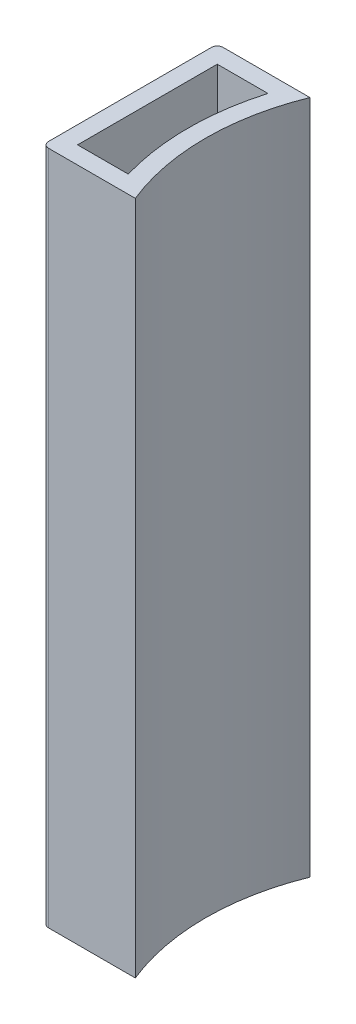
ISO-10303-21;
HEADER;
FILE_DESCRIPTION(('STEP AP214'),'2;1');
FILE_NAME('part.step','',(''),(''),'','','');
FILE_SCHEMA(('AUTOMOTIVE_DESIGN { 1 0 10303 214 1 1 1 1 }'));
ENDSEC;
DATA;
#1=APPLICATION_CONTEXT('core data for automotive mechanical design processes');
#2=APPLICATION_PROTOCOL_DEFINITION('international standard','automotive_design',2000,#1);
#3=PRODUCT_CONTEXT('',#1,'mechanical');
#4=PRODUCT('Part','Part','',(#3));
#5=PRODUCT_RELATED_PRODUCT_CATEGORY('part','',(#4));
#6=PRODUCT_DEFINITION_FORMATION('','',#4);
#7=PRODUCT_DEFINITION_CONTEXT('part definition',#1,'design');
#8=PRODUCT_DEFINITION('design','',#6,#7);
#9=PRODUCT_DEFINITION_SHAPE('','',#8);
#10=(LENGTH_UNIT() NAMED_UNIT(*) SI_UNIT(.MILLI.,.METRE.));
#11=(NAMED_UNIT(*) PLANE_ANGLE_UNIT() SI_UNIT($,.RADIAN.));
#12=(NAMED_UNIT(*) SI_UNIT($,.STERADIAN.) SOLID_ANGLE_UNIT());
#13=UNCERTAINTY_MEASURE_WITH_UNIT(LENGTH_MEASURE(1.E-05),#10,'distance_accuracy_value','');
#14=(GEOMETRIC_REPRESENTATION_CONTEXT(3) GLOBAL_UNCERTAINTY_ASSIGNED_CONTEXT((#13)) GLOBAL_UNIT_ASSIGNED_CONTEXT((#10,
#11,#12)) REPRESENTATION_CONTEXT('',''));
#15=CARTESIAN_POINT('',(0.,0.,0.));
#16=DIRECTION('',(0.,0.,1.));
#17=DIRECTION('',(1.,0.,0.));
#18=AXIS2_PLACEMENT_3D('',#15,#16,#17);
#19=CARTESIAN_POINT('',(0.,116.,0.));
#20=DIRECTION('',(0.,1.,0.));
#21=DIRECTION('',(0.,0.,1.));
#22=AXIS2_PLACEMENT_3D('',#19,#20,#21);
#23=PLANE('',#22);
#24=DIRECTION('',(0.,0.,1.));
#25=VECTOR('',#24,1.);
#26=CARTESIAN_POINT('',(0.,116.,0.));
#27=LINE('',#26,#25);
#28=CARTESIAN_POINT('',(0.,116.,1.));
#29=VERTEX_POINT('',#28);
#30=CARTESIAN_POINT('',(0.,116.,29.));
#31=VERTEX_POINT('',#30);
#32=EDGE_CURVE('E212',#29,#31,#27,.T.);
#33=ORIENTED_EDGE('',*,*,#32,.T.);
#34=CARTESIAN_POINT('',(1.,116.,29.));
#35=DIRECTION('',(0.,1.,0.));
#36=DIRECTION('',(0.,0.,1.));
#37=AXIS2_PLACEMENT_3D('',#34,#35,#36);
#38=CIRCLE('',#37,1.);
#39=CARTESIAN_POINT('',(1.,116.,30.));
#40=VERTEX_POINT('',#39);
#41=EDGE_CURVE('E45',#31,#40,#38,.T.);
#42=ORIENTED_EDGE('',*,*,#41,.T.);
#43=DIRECTION('',(1.,0.,0.));
#44=VECTOR('',#43,1.);
#45=CARTESIAN_POINT('',(0.,116.,30.));
#46=LINE('',#45,#44);
#47=CARTESIAN_POINT('',(15.9190075645217,116.,30.));
#48=VERTEX_POINT('',#47);
#49=EDGE_CURVE('E215',#40,#48,#46,.T.);
#50=ORIENTED_EDGE('',*,*,#49,.T.);
#51=CARTESIAN_POINT('',(53.,116.,15.));
#52=DIRECTION('',(0.,1.,0.));
#53=DIRECTION('',(0.,0.,1.));
#54=AXIS2_PLACEMENT_3D('',#51,#52,#53);
#55=CIRCLE('',#54,40.);
#56=CARTESIAN_POINT('',(15.9190075645217,116.,0.));
#57=VERTEX_POINT('',#56);
#58=EDGE_CURVE('E206',#57,#48,#55,.T.);
#59=ORIENTED_EDGE('',*,*,#58,.F.);
#60=DIRECTION('',(1.,0.,0.));
#61=VECTOR('',#60,1.);
#62=CARTESIAN_POINT('',(0.,116.,0.));
#63=LINE('',#62,#61);
#64=CARTESIAN_POINT('',(1.,116.,0.));
#65=VERTEX_POINT('',#64);
#66=EDGE_CURVE('E209',#65,#57,#63,.T.);
#67=ORIENTED_EDGE('',*,*,#66,.F.);
#68=CARTESIAN_POINT('',(1.,116.,1.));
#69=DIRECTION('',(0.,1.,0.));
#70=DIRECTION('',(0.,0.,1.));
#71=AXIS2_PLACEMENT_3D('',#68,#69,#70);
#72=CIRCLE('',#71,1.);
#73=EDGE_CURVE('E243',#65,#29,#72,.T.);
#74=ORIENTED_EDGE('',*,*,#73,.T.);
#75=EDGE_LOOP('',(#33,#42,#50,#59,#67,#74));
#76=FACE_BOUND('',#75,.T.);
#77=DIRECTION('',(1.,0.,0.));
#78=VECTOR('',#77,1.);
#79=CARTESIAN_POINT('',(0.,116.,3.));
#80=LINE('',#79,#78);
#81=CARTESIAN_POINT('',(3.,116.,3.));
#82=VERTEX_POINT('',#81);
#83=CARTESIAN_POINT('',(11.7083543558748,116.,3.));
#84=VERTEX_POINT('',#83);
#85=EDGE_CURVE('E199',#82,#84,#80,.T.);
#86=ORIENTED_EDGE('',*,*,#85,.T.);
#87=CARTESIAN_POINT('',(53.,116.,15.));
#88=DIRECTION('',(0.,1.,0.));
#89=DIRECTION('',(0.,0.,1.));
#90=AXIS2_PLACEMENT_3D('',#87,#88,#89);
#91=CIRCLE('',#90,43.);
#92=CARTESIAN_POINT('',(11.7083543558748,116.,27.));
#93=VERTEX_POINT('',#92);
#94=EDGE_CURVE('E191',#84,#93,#91,.T.);
#95=ORIENTED_EDGE('',*,*,#94,.T.);
#96=DIRECTION('',(1.,0.,0.));
#97=VECTOR('',#96,1.);
#98=CARTESIAN_POINT('',(0.,116.,27.));
#99=LINE('',#98,#97);
#100=CARTESIAN_POINT('',(3.,116.,27.));
#101=VERTEX_POINT('',#100);
#102=EDGE_CURVE('E181',#101,#93,#99,.T.);
#103=ORIENTED_EDGE('',*,*,#102,.F.);
#104=DIRECTION('',(0.,0.,1.));
#105=VECTOR('',#104,1.);
#106=CARTESIAN_POINT('',(3.,116.,0.));
#107=LINE('',#106,#105);
#108=EDGE_CURVE('E202',#82,#101,#107,.T.);
#109=ORIENTED_EDGE('',*,*,#108,.F.);
#110=EDGE_LOOP('',(#86,#95,#103,#109));
#111=FACE_BOUND('',#110,.T.);
#112=ADVANCED_FACE('F37',(#76,#111),#23,.T.);
#113=CARTESIAN_POINT('',(0.,0.,0.));
#114=DIRECTION('',(0.,1.,0.));
#115=DIRECTION('',(0.,0.,1.));
#116=AXIS2_PLACEMENT_3D('',#113,#114,#115);
#117=PLANE('',#116);
#118=DIRECTION('',(1.,0.,0.));
#119=VECTOR('',#118,1.);
#120=CARTESIAN_POINT('',(0.,0.,30.));
#121=LINE('',#120,#119);
#122=CARTESIAN_POINT('',(1.,0.,30.));
#123=VERTEX_POINT('',#122);
#124=CARTESIAN_POINT('',(15.9190075645217,0.,30.));
#125=VERTEX_POINT('',#124);
#126=EDGE_CURVE('E210',#123,#125,#121,.T.);
#127=ORIENTED_EDGE('',*,*,#126,.F.);
#128=CARTESIAN_POINT('',(1.,0.,29.));
#129=DIRECTION('',(0.,1.,0.));
#130=DIRECTION('',(0.,0.,1.));
#131=AXIS2_PLACEMENT_3D('',#128,#129,#130);
#132=CIRCLE('',#131,1.);
#133=CARTESIAN_POINT('',(0.,0.,29.));
#134=VERTEX_POINT('',#133);
#135=EDGE_CURVE('E236',#123,#134,#132,.F.);
#136=ORIENTED_EDGE('',*,*,#135,.T.);
#137=DIRECTION('',(0.,0.,1.));
#138=VECTOR('',#137,1.);
#139=CARTESIAN_POINT('',(0.,0.,0.));
#140=LINE('',#139,#138);
#141=CARTESIAN_POINT('',(0.,0.,1.));
#142=VERTEX_POINT('',#141);
#143=EDGE_CURVE('E222',#142,#134,#140,.T.);
#144=ORIENTED_EDGE('',*,*,#143,.F.);
#145=CARTESIAN_POINT('',(1.,0.,1.));
#146=DIRECTION('',(0.,1.,0.));
#147=DIRECTION('',(0.,0.,1.));
#148=AXIS2_PLACEMENT_3D('',#145,#146,#147);
#149=CIRCLE('',#148,1.);
#150=CARTESIAN_POINT('',(1.,0.,0.));
#151=VERTEX_POINT('',#150);
#152=EDGE_CURVE('E234',#142,#151,#149,.F.);
#153=ORIENTED_EDGE('',*,*,#152,.T.);
#154=DIRECTION('',(1.,0.,0.));
#155=VECTOR('',#154,1.);
#156=CARTESIAN_POINT('',(0.,0.,0.));
#157=LINE('',#156,#155);
#158=CARTESIAN_POINT('',(15.9190075645217,0.,0.));
#159=VERTEX_POINT('',#158);
#160=EDGE_CURVE('E220',#151,#159,#157,.T.);
#161=ORIENTED_EDGE('',*,*,#160,.T.);
#162=CARTESIAN_POINT('',(53.,0.,15.));
#163=DIRECTION('',(0.,1.,0.));
#164=DIRECTION('',(0.,0.,1.));
#165=AXIS2_PLACEMENT_3D('',#162,#163,#164);
#166=CIRCLE('',#165,40.);
#167=EDGE_CURVE('E176',#159,#125,#166,.T.);
#168=ORIENTED_EDGE('',*,*,#167,.T.);
#169=EDGE_LOOP('',(#127,#136,#144,#153,#161,#168));
#170=FACE_BOUND('',#169,.T.);
#171=CARTESIAN_POINT('',(53.,0.,15.));
#172=DIRECTION('',(0.,1.,0.));
#173=DIRECTION('',(0.,0.,1.));
#174=AXIS2_PLACEMENT_3D('',#171,#172,#173);
#175=CIRCLE('',#174,43.);
#176=CARTESIAN_POINT('',(11.7083543558748,0.,3.));
#177=VERTEX_POINT('',#176);
#178=CARTESIAN_POINT('',(11.7083543558748,0.,27.));
#179=VERTEX_POINT('',#178);
#180=EDGE_CURVE('E170',#177,#179,#175,.T.);
#181=ORIENTED_EDGE('',*,*,#180,.F.);
#182=DIRECTION('',(1.,0.,0.));
#183=VECTOR('',#182,1.);
#184=CARTESIAN_POINT('',(0.,0.,3.));
#185=LINE('',#184,#183);
#186=CARTESIAN_POINT('',(3.,0.,3.));
#187=VERTEX_POINT('',#186);
#188=EDGE_CURVE('E187',#187,#177,#185,.T.);
#189=ORIENTED_EDGE('',*,*,#188,.F.);
#190=DIRECTION('',(0.,0.,1.));
#191=VECTOR('',#190,1.);
#192=CARTESIAN_POINT('',(3.,0.,0.));
#193=LINE('',#192,#191);
#194=CARTESIAN_POINT('',(3.,0.,27.));
#195=VERTEX_POINT('',#194);
#196=EDGE_CURVE('E192',#187,#195,#193,.T.);
#197=ORIENTED_EDGE('',*,*,#196,.T.);
#198=DIRECTION('',(1.,0.,0.));
#199=VECTOR('',#198,1.);
#200=CARTESIAN_POINT('',(0.,0.,27.));
#201=LINE('',#200,#199);
#202=EDGE_CURVE('E188',#195,#179,#201,.T.);
#203=ORIENTED_EDGE('',*,*,#202,.T.);
#204=EDGE_LOOP('',(#181,#189,#197,#203));
#205=FACE_BOUND('',#204,.T.);
#206=ADVANCED_FACE('F260',(#170,#205),#117,.F.);
#207=CARTESIAN_POINT('',(53.,116.,15.));
#208=DIRECTION('',(0.,-1.,0.));
#209=DIRECTION('',(0.,0.,-1.));
#210=AXIS2_PLACEMENT_3D('',#207,#208,#209);
#211=CYLINDRICAL_SURFACE('',#210,40.);
#212=ORIENTED_EDGE('',*,*,#167,.F.);
#213=DIRECTION('',(0.,-1.,0.));
#214=VECTOR('',#213,1.);
#215=CARTESIAN_POINT('',(15.9190075645217,116.,0.));
#216=LINE('',#215,#214);
#217=EDGE_CURVE('E228',#57,#159,#216,.T.);
#218=ORIENTED_EDGE('',*,*,#217,.F.);
#219=ORIENTED_EDGE('',*,*,#58,.T.);
#220=DIRECTION('',(0.,-1.,0.));
#221=VECTOR('',#220,1.);
#222=CARTESIAN_POINT('',(15.9190075645217,116.,30.));
#223=LINE('',#222,#221);
#224=EDGE_CURVE('E217',#48,#125,#223,.T.);
#225=ORIENTED_EDGE('',*,*,#224,.T.);
#226=EDGE_LOOP('',(#212,#218,#219,#225));
#227=FACE_BOUND('',#226,.T.);
#228=ADVANCED_FACE('F275',(#227),#211,.F.);
#229=CARTESIAN_POINT('',(0.,116.,0.));
#230=DIRECTION('',(0.,0.,-1.));
#231=DIRECTION('',(-1.,0.,0.));
#232=AXIS2_PLACEMENT_3D('',#229,#230,#231);
#233=PLANE('',#232);
#234=ORIENTED_EDGE('',*,*,#160,.F.);
#235=DIRECTION('',(0.,-1.,0.));
#236=VECTOR('',#235,1.);
#237=CARTESIAN_POINT('',(1.,116.,0.));
#238=LINE('',#237,#236);
#239=EDGE_CURVE('E11',#151,#65,#238,.F.);
#240=ORIENTED_EDGE('',*,*,#239,.T.);
#241=ORIENTED_EDGE('',*,*,#66,.T.);
#242=ORIENTED_EDGE('',*,*,#217,.T.);
#243=EDGE_LOOP('',(#234,#240,#241,#242));
#244=FACE_BOUND('',#243,.T.);
#245=ADVANCED_FACE('F270',(#244),#233,.T.);
#246=CARTESIAN_POINT('',(0.,116.,0.));
#247=DIRECTION('',(1.,0.,0.));
#248=DIRECTION('',(0.,0.,-1.));
#249=AXIS2_PLACEMENT_3D('',#246,#247,#248);
#250=PLANE('',#249);
#251=DIRECTION('',(0.,-1.,0.));
#252=VECTOR('',#251,1.);
#253=CARTESIAN_POINT('',(0.,96.,11.));
#254=LINE('',#253,#252);
#255=CARTESIAN_POINT('',(0.,96.,11.));
#256=VERTEX_POINT('',#255);
#257=CARTESIAN_POINT('',(0.,20.,11.));
#258=VERTEX_POINT('',#257);
#259=EDGE_CURVE('E164',#256,#258,#254,.T.);
#260=ORIENTED_EDGE('',*,*,#259,.F.);
#261=CARTESIAN_POINT('',(0.,96.,15.));
#262=DIRECTION('',(-1.,0.,0.));
#263=DIRECTION('',(0.,0.,1.));
#264=AXIS2_PLACEMENT_3D('',#261,#262,#263);
#265=CIRCLE('',#264,4.);
#266=CARTESIAN_POINT('',(0.,96.,19.));
#267=VERTEX_POINT('',#266);
#268=EDGE_CURVE('E52',#267,#256,#265,.T.);
#269=ORIENTED_EDGE('',*,*,#268,.F.);
#270=DIRECTION('',(0.,1.,0.));
#271=VECTOR('',#270,1.);
#272=CARTESIAN_POINT('',(0.,96.,19.));
#273=LINE('',#272,#271);
#274=CARTESIAN_POINT('',(0.,20.,19.));
#275=VERTEX_POINT('',#274);
#276=EDGE_CURVE('E155',#275,#267,#273,.T.);
#277=ORIENTED_EDGE('',*,*,#276,.F.);
#278=CARTESIAN_POINT('',(0.,20.,15.));
#279=DIRECTION('',(-1.,0.,0.));
#280=DIRECTION('',(0.,0.,1.));
#281=AXIS2_PLACEMENT_3D('',#278,#279,#280);
#282=CIRCLE('',#281,4.);
#283=EDGE_CURVE('E158',#258,#275,#282,.T.);
#284=ORIENTED_EDGE('',*,*,#283,.F.);
#285=EDGE_LOOP('',(#260,#269,#277,#284));
#286=FACE_BOUND('',#285,.T.);
#287=ORIENTED_EDGE('',*,*,#143,.T.);
#288=DIRECTION('',(0.,-1.,0.));
#289=VECTOR('',#288,1.);
#290=CARTESIAN_POINT('',(0.,116.,29.));
#291=LINE('',#290,#289);
#292=EDGE_CURVE('E241',#134,#31,#291,.F.);
#293=ORIENTED_EDGE('',*,*,#292,.T.);
#294=ORIENTED_EDGE('',*,*,#32,.F.);
#295=DIRECTION('',(0.,-1.,0.));
#296=VECTOR('',#295,1.);
#297=CARTESIAN_POINT('',(0.,0.,1.));
#298=LINE('',#297,#296);
#299=EDGE_CURVE('E238',#29,#142,#298,.T.);
#300=ORIENTED_EDGE('',*,*,#299,.T.);
#301=EDGE_LOOP('',(#287,#293,#294,#300));
#302=FACE_BOUND('',#301,.T.);
#303=ADVANCED_FACE('F263',(#286,#302),#250,.F.);
#304=CARTESIAN_POINT('',(0.,116.,30.));
#305=DIRECTION('',(0.,0.,-1.));
#306=DIRECTION('',(-1.,0.,0.));
#307=AXIS2_PLACEMENT_3D('',#304,#305,#306);
#308=PLANE('',#307);
#309=ORIENTED_EDGE('',*,*,#49,.F.);
#310=DIRECTION('',(0.,-1.,0.));
#311=VECTOR('',#310,1.);
#312=CARTESIAN_POINT('',(1.,116.,30.));
#313=LINE('',#312,#311);
#314=EDGE_CURVE('E231',#40,#123,#313,.T.);
#315=ORIENTED_EDGE('',*,*,#314,.T.);
#316=ORIENTED_EDGE('',*,*,#126,.T.);
#317=ORIENTED_EDGE('',*,*,#224,.F.);
#318=EDGE_LOOP('',(#309,#315,#316,#317));
#319=FACE_BOUND('',#318,.T.);
#320=ADVANCED_FACE('F255',(#319),#308,.F.);
#321=CARTESIAN_POINT('',(53.,116.,15.));
#322=DIRECTION('',(0.,-1.,0.));
#323=DIRECTION('',(0.,0.,-1.));
#324=AXIS2_PLACEMENT_3D('',#321,#322,#323);
#325=CYLINDRICAL_SURFACE('',#324,43.);
#326=ORIENTED_EDGE('',*,*,#180,.T.);
#327=DIRECTION('',(0.,-1.,0.));
#328=VECTOR('',#327,1.);
#329=CARTESIAN_POINT('',(11.7083543558748,116.,27.));
#330=LINE('',#329,#328);
#331=EDGE_CURVE('E178',#93,#179,#330,.T.);
#332=ORIENTED_EDGE('',*,*,#331,.F.);
#333=ORIENTED_EDGE('',*,*,#94,.F.);
#334=DIRECTION('',(0.,-1.,0.));
#335=VECTOR('',#334,1.);
#336=CARTESIAN_POINT('',(11.7083543558748,116.,3.));
#337=LINE('',#336,#335);
#338=EDGE_CURVE('E174',#84,#177,#337,.T.);
#339=ORIENTED_EDGE('',*,*,#338,.T.);
#340=EDGE_LOOP('',(#326,#332,#333,#339));
#341=FACE_BOUND('',#340,.T.);
#342=ADVANCED_FACE('F297',(#341),#325,.T.);
#343=CARTESIAN_POINT('',(0.,116.,3.));
#344=DIRECTION('',(0.,0.,-1.));
#345=DIRECTION('',(-1.,0.,0.));
#346=AXIS2_PLACEMENT_3D('',#343,#344,#345);
#347=PLANE('',#346);
#348=ORIENTED_EDGE('',*,*,#188,.T.);
#349=ORIENTED_EDGE('',*,*,#338,.F.);
#350=ORIENTED_EDGE('',*,*,#85,.F.);
#351=DIRECTION('',(0.,-1.,0.));
#352=VECTOR('',#351,1.);
#353=CARTESIAN_POINT('',(3.,116.,3.));
#354=LINE('',#353,#352);
#355=EDGE_CURVE('E177',#82,#187,#354,.T.);
#356=ORIENTED_EDGE('',*,*,#355,.T.);
#357=EDGE_LOOP('',(#348,#349,#350,#356));
#358=FACE_BOUND('',#357,.T.);
#359=ADVANCED_FACE('F322',(#358),#347,.F.);
#360=CARTESIAN_POINT('',(3.,116.,0.));
#361=DIRECTION('',(1.,0.,0.));
#362=DIRECTION('',(0.,0.,-1.));
#363=AXIS2_PLACEMENT_3D('',#360,#361,#362);
#364=PLANE('',#363);
#365=CARTESIAN_POINT('',(3.,96.,15.));
#366=DIRECTION('',(-1.,0.,0.));
#367=DIRECTION('',(0.,0.,1.));
#368=AXIS2_PLACEMENT_3D('',#365,#366,#367);
#369=CIRCLE('',#368,4.);
#370=CARTESIAN_POINT('',(3.,96.,19.));
#371=VERTEX_POINT('',#370);
#372=CARTESIAN_POINT('',(3.,96.,11.));
#373=VERTEX_POINT('',#372);
#374=EDGE_CURVE('E139',#371,#373,#369,.T.);
#375=ORIENTED_EDGE('',*,*,#374,.T.);
#376=DIRECTION('',(0.,-1.,0.));
#377=VECTOR('',#376,1.);
#378=CARTESIAN_POINT('',(3.,96.,11.));
#379=LINE('',#378,#377);
#380=CARTESIAN_POINT('',(3.,20.,11.));
#381=VERTEX_POINT('',#380);
#382=EDGE_CURVE('E148',#373,#381,#379,.T.);
#383=ORIENTED_EDGE('',*,*,#382,.T.);
#384=CARTESIAN_POINT('',(3.,20.,15.));
#385=DIRECTION('',(-1.,0.,0.));
#386=DIRECTION('',(0.,0.,1.));
#387=AXIS2_PLACEMENT_3D('',#384,#385,#386);
#388=CIRCLE('',#387,4.);
#389=CARTESIAN_POINT('',(3.,20.,19.));
#390=VERTEX_POINT('',#389);
#391=EDGE_CURVE('E60',#381,#390,#388,.T.);
#392=ORIENTED_EDGE('',*,*,#391,.T.);
#393=DIRECTION('',(0.,1.,0.));
#394=VECTOR('',#393,1.);
#395=CARTESIAN_POINT('',(3.,96.,19.));
#396=LINE('',#395,#394);
#397=EDGE_CURVE('E145',#390,#371,#396,.T.);
#398=ORIENTED_EDGE('',*,*,#397,.T.);
#399=EDGE_LOOP('',(#375,#383,#392,#398));
#400=FACE_BOUND('',#399,.T.);
#401=ORIENTED_EDGE('',*,*,#196,.F.);
#402=ORIENTED_EDGE('',*,*,#355,.F.);
#403=ORIENTED_EDGE('',*,*,#108,.T.);
#404=DIRECTION('',(0.,-1.,0.));
#405=VECTOR('',#404,1.);
#406=CARTESIAN_POINT('',(3.,116.,27.));
#407=LINE('',#406,#405);
#408=EDGE_CURVE('E180',#101,#195,#407,.T.);
#409=ORIENTED_EDGE('',*,*,#408,.T.);
#410=EDGE_LOOP('',(#401,#402,#403,#409));
#411=FACE_BOUND('',#410,.T.);
#412=ADVANCED_FACE('F152',(#400,#411),#364,.T.);
#413=CARTESIAN_POINT('',(0.,116.,27.));
#414=DIRECTION('',(0.,0.,-1.));
#415=DIRECTION('',(-1.,0.,0.));
#416=AXIS2_PLACEMENT_3D('',#413,#414,#415);
#417=PLANE('',#416);
#418=ORIENTED_EDGE('',*,*,#202,.F.);
#419=ORIENTED_EDGE('',*,*,#408,.F.);
#420=ORIENTED_EDGE('',*,*,#102,.T.);
#421=ORIENTED_EDGE('',*,*,#331,.T.);
#422=EDGE_LOOP('',(#418,#419,#420,#421));
#423=FACE_BOUND('',#422,.T.);
#424=ADVANCED_FACE('F292',(#423),#417,.T.);
#425=CARTESIAN_POINT('',(1.,116.,29.));
#426=DIRECTION('',(0.,-1.,0.));
#427=DIRECTION('',(0.,0.,-1.));
#428=AXIS2_PLACEMENT_3D('',#425,#426,#427);
#429=CYLINDRICAL_SURFACE('',#428,1.);
#430=ORIENTED_EDGE('',*,*,#41,.F.);
#431=ORIENTED_EDGE('',*,*,#292,.F.);
#432=ORIENTED_EDGE('',*,*,#135,.F.);
#433=ORIENTED_EDGE('',*,*,#314,.F.);
#434=EDGE_LOOP('',(#430,#431,#432,#433));
#435=FACE_BOUND('',#434,.T.);
#436=ADVANCED_FACE('F257',(#435),#429,.T.);
#437=CARTESIAN_POINT('',(1.,116.,1.));
#438=DIRECTION('',(0.,1.,0.));
#439=DIRECTION('',(0.,0.,1.));
#440=AXIS2_PLACEMENT_3D('',#437,#438,#439);
#441=CYLINDRICAL_SURFACE('',#440,1.);
#442=ORIENTED_EDGE('',*,*,#73,.F.);
#443=ORIENTED_EDGE('',*,*,#239,.F.);
#444=ORIENTED_EDGE('',*,*,#152,.F.);
#445=ORIENTED_EDGE('',*,*,#299,.F.);
#446=EDGE_LOOP('',(#442,#443,#444,#445));
#447=FACE_BOUND('',#446,.T.);
#448=ADVANCED_FACE('F39',(#447),#441,.T.);
#449=CARTESIAN_POINT('',(3.,96.,15.));
#450=DIRECTION('',(-1.,0.,0.));
#451=DIRECTION('',(0.,0.,1.));
#452=AXIS2_PLACEMENT_3D('',#449,#450,#451);
#453=CYLINDRICAL_SURFACE('',#452,4.);
#454=ORIENTED_EDGE('',*,*,#268,.T.);
#455=DIRECTION('',(-1.,0.,0.));
#456=VECTOR('',#455,1.);
#457=CARTESIAN_POINT('',(3.,96.,11.));
#458=LINE('',#457,#456);
#459=EDGE_CURVE('E135',#373,#256,#458,.T.);
#460=ORIENTED_EDGE('',*,*,#459,.F.);
#461=ORIENTED_EDGE('',*,*,#374,.F.);
#462=DIRECTION('',(-1.,0.,0.));
#463=VECTOR('',#462,1.);
#464=CARTESIAN_POINT('',(3.,96.,19.));
#465=LINE('',#464,#463);
#466=EDGE_CURVE('E168',#371,#267,#465,.T.);
#467=ORIENTED_EDGE('',*,*,#466,.T.);
#468=EDGE_LOOP('',(#454,#460,#461,#467));
#469=FACE_BOUND('',#468,.T.);
#470=ADVANCED_FACE('F137',(#469),#453,.F.);
#471=CARTESIAN_POINT('',(3.,96.,19.));
#472=DIRECTION('',(0.,0.,1.));
#473=DIRECTION('',(0.,-1.,0.));
#474=AXIS2_PLACEMENT_3D('',#471,#472,#473);
#475=PLANE('',#474);
#476=ORIENTED_EDGE('',*,*,#276,.T.);
#477=ORIENTED_EDGE('',*,*,#466,.F.);
#478=ORIENTED_EDGE('',*,*,#397,.F.);
#479=DIRECTION('',(-1.,0.,0.));
#480=VECTOR('',#479,1.);
#481=CARTESIAN_POINT('',(3.,20.,19.));
#482=LINE('',#481,#480);
#483=EDGE_CURVE('E171',#390,#275,#482,.T.);
#484=ORIENTED_EDGE('',*,*,#483,.T.);
#485=EDGE_LOOP('',(#476,#477,#478,#484));
#486=FACE_BOUND('',#485,.T.);
#487=ADVANCED_FACE('F308',(#486),#475,.F.);
#488=CARTESIAN_POINT('',(3.,20.,15.));
#489=DIRECTION('',(-1.,0.,0.));
#490=DIRECTION('',(0.,0.,1.));
#491=AXIS2_PLACEMENT_3D('',#488,#489,#490);
#492=CYLINDRICAL_SURFACE('',#491,4.);
#493=ORIENTED_EDGE('',*,*,#283,.T.);
#494=ORIENTED_EDGE('',*,*,#483,.F.);
#495=ORIENTED_EDGE('',*,*,#391,.F.);
#496=DIRECTION('',(-1.,0.,0.));
#497=VECTOR('',#496,1.);
#498=CARTESIAN_POINT('',(3.,20.,11.));
#499=LINE('',#498,#497);
#500=EDGE_CURVE('E144',#381,#258,#499,.T.);
#501=ORIENTED_EDGE('',*,*,#500,.T.);
#502=EDGE_LOOP('',(#493,#494,#495,#501));
#503=FACE_BOUND('',#502,.T.);
#504=ADVANCED_FACE('F306',(#503),#492,.F.);
#505=CARTESIAN_POINT('',(3.,96.,11.));
#506=DIRECTION('',(0.,0.,-1.));
#507=DIRECTION('',(0.,1.,0.));
#508=AXIS2_PLACEMENT_3D('',#505,#506,#507);
#509=PLANE('',#508);
#510=ORIENTED_EDGE('',*,*,#259,.T.);
#511=ORIENTED_EDGE('',*,*,#500,.F.);
#512=ORIENTED_EDGE('',*,*,#382,.F.);
#513=ORIENTED_EDGE('',*,*,#459,.T.);
#514=EDGE_LOOP('',(#510,#511,#512,#513));
#515=FACE_BOUND('',#514,.T.);
#516=ADVANCED_FACE('F149',(#515),#509,.F.);
#517=CLOSED_SHELL('',(#112,#206,#228,#245,#303,#320,#342,#359,#412,#424,#436,#448,#470,#487,
#504,#516));
#518=MANIFOLD_SOLID_BREP('B2',#517);
#519=ADVANCED_BREP_SHAPE_REPRESENTATION('',(#18,#518),#14);
#520=SHAPE_DEFINITION_REPRESENTATION(#9,#519);
ENDSEC;
END-ISO-10303-21;
